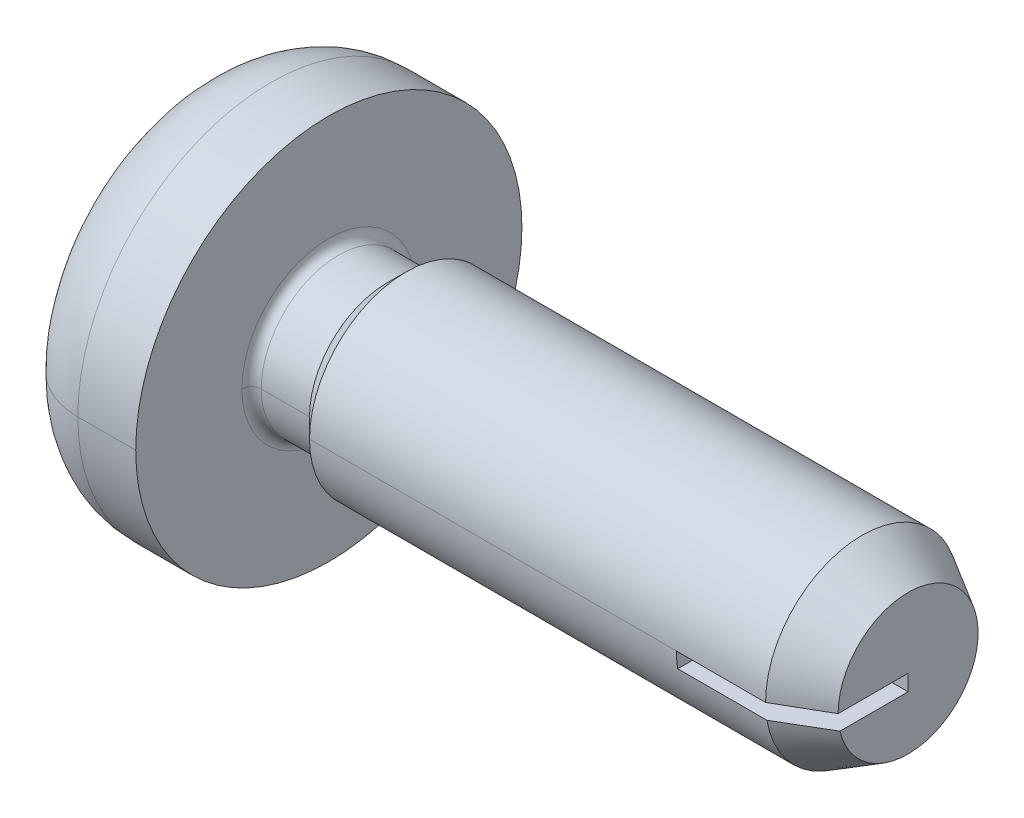
ISO-10303-21;
HEADER;
FILE_DESCRIPTION(('STEP AP214'),'2;1');
FILE_NAME('part.step','',(''),(''),'','','');
FILE_SCHEMA(('AUTOMOTIVE_DESIGN { 1 0 10303 214 1 1 1 1 }'));
ENDSEC;
DATA;
#1=APPLICATION_CONTEXT('core data for automotive mechanical design processes');
#2=APPLICATION_PROTOCOL_DEFINITION('international standard','automotive_design',2000,#1);
#3=PRODUCT_CONTEXT('',#1,'mechanical');
#4=PRODUCT('Part','Part','',(#3));
#5=PRODUCT_RELATED_PRODUCT_CATEGORY('part','',(#4));
#6=PRODUCT_DEFINITION_FORMATION('','',#4);
#7=PRODUCT_DEFINITION_CONTEXT('part definition',#1,'design');
#8=PRODUCT_DEFINITION('design','',#6,#7);
#9=PRODUCT_DEFINITION_SHAPE('','',#8);
#10=(LENGTH_UNIT() NAMED_UNIT(*) SI_UNIT(.MILLI.,.METRE.));
#11=(NAMED_UNIT(*) PLANE_ANGLE_UNIT() SI_UNIT($,.RADIAN.));
#12=(NAMED_UNIT(*) SI_UNIT($,.STERADIAN.) SOLID_ANGLE_UNIT());
#13=UNCERTAINTY_MEASURE_WITH_UNIT(LENGTH_MEASURE(1.E-05),#10,'distance_accuracy_value','');
#14=(GEOMETRIC_REPRESENTATION_CONTEXT(3) GLOBAL_UNCERTAINTY_ASSIGNED_CONTEXT((#13)) GLOBAL_UNIT_ASSIGNED_CONTEXT((#10,
#11,#12)) REPRESENTATION_CONTEXT('',''));
#15=CARTESIAN_POINT('',(0.,0.,0.));
#16=DIRECTION('',(0.,0.,1.));
#17=DIRECTION('',(1.,0.,0.));
#18=AXIS2_PLACEMENT_3D('',#15,#16,#17);
#19=CARTESIAN_POINT('',(7.4,0.,0.));
#20=DIRECTION('',(0.,0.,-1.));
#21=DIRECTION('',(0.,-1.,0.));
#22=AXIS2_PLACEMENT_3D('',#19,#20,#21);
#23=PLANE('',#22);
#24=DIRECTION('',(0.,1.,0.));
#25=VECTOR('',#24,1.);
#26=CARTESIAN_POINT('',(7.4,0.,0.));
#27=LINE('',#26,#25);
#28=CARTESIAN_POINT('',(7.4,-0.166666666666667,0.));
#29=VERTEX_POINT('',#28);
#30=CARTESIAN_POINT('',(7.4,0.,0.));
#31=VERTEX_POINT('',#30);
#32=EDGE_CURVE('E333',#29,#31,#27,.T.);
#33=ORIENTED_EDGE('',*,*,#32,.T.);
#34=DIRECTION('',(-1.,0.,0.));
#35=VECTOR('',#34,1.);
#36=CARTESIAN_POINT('',(7.4,0.,0.));
#37=LINE('',#36,#35);
#38=CARTESIAN_POINT('',(6.,0.,0.));
#39=VERTEX_POINT('',#38);
#40=EDGE_CURVE('E26',#31,#39,#37,.T.);
#41=ORIENTED_EDGE('',*,*,#40,.T.);
#42=DIRECTION('',(0.,-1.,0.));
#43=VECTOR('',#42,1.);
#44=CARTESIAN_POINT('',(6.,0.,0.));
#45=LINE('',#44,#43);
#46=CARTESIAN_POINT('',(6.,-0.166666666666667,0.));
#47=VERTEX_POINT('',#46);
#48=EDGE_CURVE('E584',#39,#47,#45,.T.);
#49=ORIENTED_EDGE('',*,*,#48,.T.);
#50=DIRECTION('',(1.,0.,0.));
#51=VECTOR('',#50,1.);
#52=CARTESIAN_POINT('',(7.4,-0.166666666666667,0.));
#53=LINE('',#52,#51);
#54=EDGE_CURVE('E11',#47,#29,#53,.T.);
#55=ORIENTED_EDGE('',*,*,#54,.T.);
#56=EDGE_LOOP('',(#33,#41,#49,#55));
#57=FACE_BOUND('',#56,.T.);
#58=ADVANCED_FACE('F17',(#57),#23,.F.);
#59=CARTESIAN_POINT('',(7.4,-0.166666666666667,2.));
#60=DIRECTION('',(0.,1.,0.));
#61=DIRECTION('',(1.,0.,0.));
#62=AXIS2_PLACEMENT_3D('',#59,#60,#61);
#63=PLANE('',#62);
#64=DIRECTION('',(1.,0.,0.));
#65=VECTOR('',#64,1.);
#66=CARTESIAN_POINT('',(0.,-0.166666666666668,0.986013297183269));
#67=LINE('',#66,#65);
#68=CARTESIAN_POINT('',(6.,-0.166666666666667,0.986013297183269));
#69=VERTEX_POINT('',#68);
#70=CARTESIAN_POINT('',(6.92368602791855,-0.166666666666667,0.98601329718327));
#71=VERTEX_POINT('',#70);
#72=EDGE_CURVE('E351',#69,#71,#67,.T.);
#73=ORIENTED_EDGE('',*,*,#72,.T.);
#74=CARTESIAN_POINT('',(7.4,-0.166666666666666,0.705582895358314));
#75=CARTESIAN_POINT('',(7.38300130994477,-0.166666959363703,0.715667010676976));
#76=CARTESIAN_POINT('',(7.36599749108841,-0.166669181672599,0.725742474908279));
#77=CARTESIAN_POINT('',(7.33117802574786,-0.166675338828009,0.746353442960607));
#78=CARTESIAN_POINT('',(7.31336194482135,-0.166679349559202,0.756888212869014));
#79=CARTESIAN_POINT('',(7.27691798817995,-0.166686625474542,0.778418137297362));
#80=CARTESIAN_POINT('',(7.25828972493106,-0.166689848895698,0.789412635760343));
#81=CARTESIAN_POINT('',(7.22022133963915,-0.166694363587721,0.811862070899512));
#82=CARTESIAN_POINT('',(7.20078086420416,-0.1666955655014,0.823316408304389));
#83=CARTESIAN_POINT('',(7.16108802848806,-0.16669558234106,0.846685527933959));
#84=CARTESIAN_POINT('',(7.14083534428021,-0.166694296485835,0.858599759927784));
#85=CARTESIAN_POINT('',(7.09951805944336,-0.166689789509248,0.882888576039516));
#86=CARTESIAN_POINT('',(7.07845315902823,-0.166686493553965,0.895262650157091));
#87=CARTESIAN_POINT('',(7.03551142662372,-0.166679258106796,0.920471012457938));
#88=CARTESIAN_POINT('',(7.01363431560257,-0.166675298842382,0.933304825285911));
#89=CARTESIAN_POINT('',(6.96906811202258,-0.166669003188876,0.95943241077416));
#90=CARTESIAN_POINT('',(6.94637875666407,-0.16666673186243,0.972725735198833));
#91=CARTESIAN_POINT('',(6.92368602791855,-0.166666666666664,0.98601329718327));
#92=B_SPLINE_CURVE_WITH_KNOTS('',3,(#74,#75,#76,#77,#78,#79,#80,#81,#82,#83,#84,#85,#86,#87,#88,
#89,#90,#91),.UNSPECIFIED.,.F.,.F.,(4,2,2,2,2,2,2,2,4),(0.,0.059294205622961,0.121387249759102,
0.186279621922835,0.253971605069076,0.32446331069776,0.397754709070723,0.473845655864087,
0.552735916252404),.UNSPECIFIED.);
#93=CARTESIAN_POINT('',(7.4,-0.166666666666667,0.705582895358315));
#94=VERTEX_POINT('',#93);
#95=EDGE_CURVE('E334',#94,#71,#92,.T.);
#96=ORIENTED_EDGE('',*,*,#95,.F.);
#97=DIRECTION('',(0.,0.,-1.));
#98=VECTOR('',#97,1.);
#99=CARTESIAN_POINT('',(7.4,-0.166666666666667,0.));
#100=LINE('',#99,#98);
#101=EDGE_CURVE('E421',#94,#29,#100,.T.);
#102=ORIENTED_EDGE('',*,*,#101,.T.);
#103=ORIENTED_EDGE('',*,*,#54,.F.);
#104=DIRECTION('',(0.,0.,-1.));
#105=VECTOR('',#104,1.);
#106=CARTESIAN_POINT('',(6.,-0.166666666666667,2.));
#107=LINE('',#106,#105);
#108=EDGE_CURVE('E580',#69,#47,#107,.T.);
#109=ORIENTED_EDGE('',*,*,#108,.F.);
#110=EDGE_LOOP('',(#73,#96,#102,#103,#109));
#111=FACE_BOUND('',#110,.T.);
#112=ADVANCED_FACE('F713',(#111),#63,.T.);
#113=CARTESIAN_POINT('',(7.4,0.,2.));
#114=DIRECTION('',(0.,-1.,0.));
#115=DIRECTION('',(-1.,0.,0.));
#116=AXIS2_PLACEMENT_3D('',#113,#114,#115);
#117=PLANE('',#116);
#118=DIRECTION('',(-1.,0.,0.));
#119=VECTOR('',#118,1.);
#120=CARTESIAN_POINT('',(0.,0.,1.));
#121=LINE('',#120,#119);
#122=CARTESIAN_POINT('',(6.92368602791855,0.,1.));
#123=VERTEX_POINT('',#122);
#124=CARTESIAN_POINT('',(6.,0.,1.));
#125=VERTEX_POINT('',#124);
#126=EDGE_CURVE('E398',#123,#125,#121,.T.);
#127=ORIENTED_EDGE('',*,*,#126,.T.);
#128=DIRECTION('',(0.,0.,-1.));
#129=VECTOR('',#128,1.);
#130=CARTESIAN_POINT('',(6.,0.,2.));
#131=LINE('',#130,#129);
#132=EDGE_CURVE('E587',#125,#39,#131,.T.);
#133=ORIENTED_EDGE('',*,*,#132,.T.);
#134=ORIENTED_EDGE('',*,*,#40,.F.);
#135=DIRECTION('',(0.,0.,1.));
#136=VECTOR('',#135,1.);
#137=CARTESIAN_POINT('',(7.4,0.,0.));
#138=LINE('',#137,#136);
#139=CARTESIAN_POINT('',(7.4,0.,0.725));
#140=VERTEX_POINT('',#139);
#141=EDGE_CURVE('E331',#31,#140,#138,.T.);
#142=ORIENTED_EDGE('',*,*,#141,.T.);
#143=DIRECTION('',(0.866025403784442,0.,-0.499999999999994));
#144=VECTOR('',#143,1.);
#145=CARTESIAN_POINT('',(8.65573683548746,0.,0.));
#146=LINE('',#145,#144);
#147=EDGE_CURVE('E411',#123,#140,#146,.T.);
#148=ORIENTED_EDGE('',*,*,#147,.F.);
#149=EDGE_LOOP('',(#127,#133,#134,#142,#148));
#150=FACE_BOUND('',#149,.T.);
#151=ADVANCED_FACE('F710',(#150),#117,.T.);
#152=CARTESIAN_POINT('',(6.,0.,2.));
#153=DIRECTION('',(1.,0.,0.));
#154=DIRECTION('',(0.,1.,0.));
#155=AXIS2_PLACEMENT_3D('',#152,#153,#154);
#156=PLANE('',#155);
#157=CARTESIAN_POINT('',(6.,0.,0.));
#158=DIRECTION('',(1.,0.,0.));
#159=DIRECTION('',(0.,0.,-1.));
#160=AXIS2_PLACEMENT_3D('',#157,#158,#159);
#161=CIRCLE('',#160,1.);
#162=EDGE_CURVE('E346',#125,#69,#161,.T.);
#163=ORIENTED_EDGE('',*,*,#162,.T.);
#164=ORIENTED_EDGE('',*,*,#108,.T.);
#165=ORIENTED_EDGE('',*,*,#48,.F.);
#166=ORIENTED_EDGE('',*,*,#132,.F.);
#167=EDGE_LOOP('',(#163,#164,#165,#166));
#168=FACE_BOUND('',#167,.T.);
#169=ADVANCED_FACE('F706',(#168),#156,.T.);
#170=CARTESIAN_POINT('',(1.25264170234784,-0.479,0.265));
#171=DIRECTION('',(0.,-0.707106781186546,0.707106781186549));
#172=DIRECTION('',(-1.,0.,0.));
#173=AXIS2_PLACEMENT_3D('',#170,#171,#172);
#174=PLANE('',#173);
#175=DIRECTION('',(0.,-0.707106781186549,-0.707106781186546));
#176=VECTOR('',#175,1.);
#177=CARTESIAN_POINT('',(0.95,-0.479,0.265));
#178=LINE('',#177,#176);
#179=CARTESIAN_POINT('',(0.95,-0.265,0.479));
#180=VERTEX_POINT('',#179);
#181=CARTESIAN_POINT('',(0.95,-0.479,0.265));
#182=VERTEX_POINT('',#181);
#183=EDGE_CURVE('E341',#180,#182,#178,.T.);
#184=ORIENTED_EDGE('',*,*,#183,.T.);
#185=DIRECTION('',(-1.,0.,0.));
#186=VECTOR('',#185,1.);
#187=CARTESIAN_POINT('',(1.25264170234784,-0.479,0.265));
#188=LINE('',#187,#186);
#189=CARTESIAN_POINT('',(0.,-0.479,0.265));
#190=VERTEX_POINT('',#189);
#191=EDGE_CURVE('E495',#182,#190,#188,.T.);
#192=ORIENTED_EDGE('',*,*,#191,.T.);
#193=DIRECTION('',(0.,0.707106781186549,0.707106781186546));
#194=VECTOR('',#193,1.);
#195=CARTESIAN_POINT('',(0.,-0.479,0.265));
#196=LINE('',#195,#194);
#197=CARTESIAN_POINT('',(0.,-0.265,0.479));
#198=VERTEX_POINT('',#197);
#199=EDGE_CURVE('E440',#190,#198,#196,.T.);
#200=ORIENTED_EDGE('',*,*,#199,.T.);
#201=DIRECTION('',(-1.,0.,0.));
#202=VECTOR('',#201,1.);
#203=CARTESIAN_POINT('',(1.25264170234784,-0.265,0.479));
#204=LINE('',#203,#202);
#205=EDGE_CURVE('E316',#180,#198,#204,.T.);
#206=ORIENTED_EDGE('',*,*,#205,.F.);
#207=EDGE_LOOP('',(#184,#192,#200,#206));
#208=FACE_BOUND('',#207,.T.);
#209=ADVANCED_FACE('F702',(#208),#174,.F.);
#210=CARTESIAN_POINT('',(1.25264170234784,-0.479,-0.265));
#211=DIRECTION('',(0.,-0.707106781186546,-0.707106781186549));
#212=DIRECTION('',(0.,-0.707106781186549,0.707106781186546));
#213=AXIS2_PLACEMENT_3D('',#210,#211,#212);
#214=PLANE('',#213);
#215=DIRECTION('',(0.,0.707106781186549,-0.707106781186546));
#216=VECTOR('',#215,1.);
#217=CARTESIAN_POINT('',(0.95,-0.479,-0.265));
#218=LINE('',#217,#216);
#219=CARTESIAN_POINT('',(0.95,-0.479,-0.265));
#220=VERTEX_POINT('',#219);
#221=CARTESIAN_POINT('',(0.95,-0.265,-0.479));
#222=VERTEX_POINT('',#221);
#223=EDGE_CURVE('E577',#220,#222,#218,.T.);
#224=ORIENTED_EDGE('',*,*,#223,.T.);
#225=DIRECTION('',(-1.,0.,0.));
#226=VECTOR('',#225,1.);
#227=CARTESIAN_POINT('',(1.25264170234784,-0.265,-0.479));
#228=LINE('',#227,#226);
#229=CARTESIAN_POINT('',(0.,-0.265,-0.479));
#230=VERTEX_POINT('',#229);
#231=EDGE_CURVE('E407',#222,#230,#228,.T.);
#232=ORIENTED_EDGE('',*,*,#231,.T.);
#233=DIRECTION('',(0.,-0.707106781186549,0.707106781186546));
#234=VECTOR('',#233,1.);
#235=CARTESIAN_POINT('',(0.,-0.479,-0.265));
#236=LINE('',#235,#234);
#237=CARTESIAN_POINT('',(0.,-0.479,-0.265));
#238=VERTEX_POINT('',#237);
#239=EDGE_CURVE('E449',#230,#238,#236,.T.);
#240=ORIENTED_EDGE('',*,*,#239,.T.);
#241=DIRECTION('',(-1.,0.,0.));
#242=VECTOR('',#241,1.);
#243=CARTESIAN_POINT('',(1.25264170234784,-0.479,-0.265));
#244=LINE('',#243,#242);
#245=EDGE_CURVE('E408',#220,#238,#244,.T.);
#246=ORIENTED_EDGE('',*,*,#245,.F.);
#247=EDGE_LOOP('',(#224,#232,#240,#246));
#248=FACE_BOUND('',#247,.T.);
#249=ADVANCED_FACE('F669',(#248),#214,.F.);
#250=CARTESIAN_POINT('',(1.25264170234784,0.479,-0.265));
#251=DIRECTION('',(0.,0.707106781186547,-0.707106781186549));
#252=DIRECTION('',(-1.,0.,0.));
#253=AXIS2_PLACEMENT_3D('',#250,#251,#252);
#254=PLANE('',#253);
#255=DIRECTION('',(0.,0.707106781186549,0.707106781186547));
#256=VECTOR('',#255,1.);
#257=CARTESIAN_POINT('',(0.95,0.479,-0.265));
#258=LINE('',#257,#256);
#259=CARTESIAN_POINT('',(0.95,0.265,-0.479));
#260=VERTEX_POINT('',#259);
#261=CARTESIAN_POINT('',(0.95,0.479,-0.265));
#262=VERTEX_POINT('',#261);
#263=EDGE_CURVE('E418',#260,#262,#258,.T.);
#264=ORIENTED_EDGE('',*,*,#263,.T.);
#265=DIRECTION('',(-1.,0.,0.));
#266=VECTOR('',#265,1.);
#267=CARTESIAN_POINT('',(1.25264170234784,0.479,-0.265));
#268=LINE('',#267,#266);
#269=CARTESIAN_POINT('',(0.,0.479,-0.265));
#270=VERTEX_POINT('',#269);
#271=EDGE_CURVE('E283',#262,#270,#268,.T.);
#272=ORIENTED_EDGE('',*,*,#271,.T.);
#273=DIRECTION('',(0.,-0.707106781186549,-0.707106781186547));
#274=VECTOR('',#273,1.);
#275=CARTESIAN_POINT('',(0.,0.479,-0.265));
#276=LINE('',#275,#274);
#277=CARTESIAN_POINT('',(0.,0.265,-0.479));
#278=VERTEX_POINT('',#277);
#279=EDGE_CURVE('E477',#270,#278,#276,.T.);
#280=ORIENTED_EDGE('',*,*,#279,.T.);
#281=DIRECTION('',(-1.,0.,0.));
#282=VECTOR('',#281,1.);
#283=CARTESIAN_POINT('',(1.25264170234784,0.265,-0.479));
#284=LINE('',#283,#282);
#285=EDGE_CURVE('E425',#260,#278,#284,.T.);
#286=ORIENTED_EDGE('',*,*,#285,.F.);
#287=EDGE_LOOP('',(#264,#272,#280,#286));
#288=FACE_BOUND('',#287,.T.);
#289=ADVANCED_FACE('F665',(#288),#254,.F.);
#290=CARTESIAN_POINT('',(1.25264170234784,0.479,0.265));
#291=DIRECTION('',(0.,0.707106781186547,0.707106781186549));
#292=DIRECTION('',(1.,0.,0.));
#293=AXIS2_PLACEMENT_3D('',#290,#291,#292);
#294=PLANE('',#293);
#295=DIRECTION('',(0.,-0.707106781186549,0.707106781186547));
#296=VECTOR('',#295,1.);
#297=CARTESIAN_POINT('',(0.95,0.479,0.265));
#298=LINE('',#297,#296);
#299=CARTESIAN_POINT('',(0.95,0.479,0.265));
#300=VERTEX_POINT('',#299);
#301=CARTESIAN_POINT('',(0.95,0.265,0.479));
#302=VERTEX_POINT('',#301);
#303=EDGE_CURVE('E344',#300,#302,#298,.T.);
#304=ORIENTED_EDGE('',*,*,#303,.T.);
#305=DIRECTION('',(-1.,0.,0.));
#306=VECTOR('',#305,1.);
#307=CARTESIAN_POINT('',(1.25264170234784,0.265,0.479));
#308=LINE('',#307,#306);
#309=CARTESIAN_POINT('',(0.,0.265,0.479));
#310=VERTEX_POINT('',#309);
#311=EDGE_CURVE('E436',#302,#310,#308,.T.);
#312=ORIENTED_EDGE('',*,*,#311,.T.);
#313=DIRECTION('',(0.,0.707106781186549,-0.707106781186547));
#314=VECTOR('',#313,1.);
#315=CARTESIAN_POINT('',(0.,0.479,0.265));
#316=LINE('',#315,#314);
#317=CARTESIAN_POINT('',(0.,0.479,0.265));
#318=VERTEX_POINT('',#317);
#319=EDGE_CURVE('E503',#310,#318,#316,.T.);
#320=ORIENTED_EDGE('',*,*,#319,.T.);
#321=DIRECTION('',(-1.,0.,0.));
#322=VECTOR('',#321,1.);
#323=CARTESIAN_POINT('',(1.25264170234784,0.479,0.265));
#324=LINE('',#323,#322);
#325=EDGE_CURVE('E371',#300,#318,#324,.T.);
#326=ORIENTED_EDGE('',*,*,#325,.F.);
#327=EDGE_LOOP('',(#304,#312,#320,#326));
#328=FACE_BOUND('',#327,.T.);
#329=ADVANCED_FACE('F668',(#328),#294,.F.);
#330=CARTESIAN_POINT('',(0.95,0.265,-0.265));
#331=DIRECTION('',(-1.,0.,0.));
#332=DIRECTION('',(0.,0.,1.));
#333=AXIS2_PLACEMENT_3D('',#330,#331,#332);
#334=PLANE('',#333);
#335=DIRECTION('',(0.,-1.,0.));
#336=VECTOR('',#335,1.);
#337=CARTESIAN_POINT('',(0.95,-0.265,0.265));
#338=LINE('',#337,#336);
#339=CARTESIAN_POINT('',(0.95,-0.724228277447107,0.265));
#340=VERTEX_POINT('',#339);
#341=EDGE_CURVE('E490',#182,#340,#338,.T.);
#342=ORIENTED_EDGE('',*,*,#341,.F.);
#343=ORIENTED_EDGE('',*,*,#183,.F.);
#344=DIRECTION('',(0.,0.,-1.));
#345=VECTOR('',#344,1.);
#346=CARTESIAN_POINT('',(0.95,-0.265,0.265));
#347=LINE('',#346,#345);
#348=CARTESIAN_POINT('',(0.95,-0.265,0.724228277447107));
#349=VERTEX_POINT('',#348);
#350=EDGE_CURVE('E318',#349,#180,#347,.T.);
#351=ORIENTED_EDGE('',*,*,#350,.F.);
#352=DIRECTION('',(0.,-1.,0.));
#353=VECTOR('',#352,1.);
#354=CARTESIAN_POINT('',(0.95,0.265,0.724228277447107));
#355=LINE('',#354,#353);
#356=CARTESIAN_POINT('',(0.95,0.265,0.724228277447107));
#357=VERTEX_POINT('',#356);
#358=EDGE_CURVE('E432',#357,#349,#355,.T.);
#359=ORIENTED_EDGE('',*,*,#358,.F.);
#360=DIRECTION('',(0.,0.,1.));
#361=VECTOR('',#360,1.);
#362=CARTESIAN_POINT('',(0.95,0.265,0.265));
#363=LINE('',#362,#361);
#364=EDGE_CURVE('E481',#302,#357,#363,.T.);
#365=ORIENTED_EDGE('',*,*,#364,.F.);
#366=ORIENTED_EDGE('',*,*,#303,.F.);
#367=DIRECTION('',(0.,-1.,0.));
#368=VECTOR('',#367,1.);
#369=CARTESIAN_POINT('',(0.95,1.07,0.265));
#370=LINE('',#369,#368);
#371=CARTESIAN_POINT('',(0.95,0.724228277447107,0.265));
#372=VERTEX_POINT('',#371);
#373=EDGE_CURVE('E374',#372,#300,#370,.T.);
#374=ORIENTED_EDGE('',*,*,#373,.F.);
#375=DIRECTION('',(0.,0.,1.));
#376=VECTOR('',#375,1.);
#377=CARTESIAN_POINT('',(0.95,0.724228277447107,-0.265));
#378=LINE('',#377,#376);
#379=CARTESIAN_POINT('',(0.95,0.724228277447107,-0.265));
#380=VERTEX_POINT('',#379);
#381=EDGE_CURVE('E520',#380,#372,#378,.T.);
#382=ORIENTED_EDGE('',*,*,#381,.F.);
#383=DIRECTION('',(0.,1.,0.));
#384=VECTOR('',#383,1.);
#385=CARTESIAN_POINT('',(0.95,1.07,-0.265));
#386=LINE('',#385,#384);
#387=EDGE_CURVE('E523',#262,#380,#386,.T.);
#388=ORIENTED_EDGE('',*,*,#387,.F.);
#389=ORIENTED_EDGE('',*,*,#263,.F.);
#390=DIRECTION('',(0.,0.,1.));
#391=VECTOR('',#390,1.);
#392=CARTESIAN_POINT('',(0.95,0.265,-1.07));
#393=LINE('',#392,#391);
#394=CARTESIAN_POINT('',(0.95,0.265,-0.724228277447106));
#395=VERTEX_POINT('',#394);
#396=EDGE_CURVE('E345',#395,#260,#393,.T.);
#397=ORIENTED_EDGE('',*,*,#396,.F.);
#398=DIRECTION('',(0.,1.,0.));
#399=VECTOR('',#398,1.);
#400=CARTESIAN_POINT('',(0.95,0.265,-0.724228277447106));
#401=LINE('',#400,#399);
#402=CARTESIAN_POINT('',(0.95,-0.265,-0.724228277447107));
#403=VERTEX_POINT('',#402);
#404=EDGE_CURVE('E560',#403,#395,#401,.T.);
#405=ORIENTED_EDGE('',*,*,#404,.F.);
#406=DIRECTION('',(0.,0.,-1.));
#407=VECTOR('',#406,1.);
#408=CARTESIAN_POINT('',(0.95,-0.265,-1.07));
#409=LINE('',#408,#407);
#410=EDGE_CURVE('E561',#222,#403,#409,.T.);
#411=ORIENTED_EDGE('',*,*,#410,.F.);
#412=ORIENTED_EDGE('',*,*,#223,.F.);
#413=DIRECTION('',(0.,1.,0.));
#414=VECTOR('',#413,1.);
#415=CARTESIAN_POINT('',(0.95,-0.265,-0.265));
#416=LINE('',#415,#414);
#417=CARTESIAN_POINT('',(0.95,-0.724228277447107,-0.265));
#418=VERTEX_POINT('',#417);
#419=EDGE_CURVE('E403',#418,#220,#416,.T.);
#420=ORIENTED_EDGE('',*,*,#419,.F.);
#421=DIRECTION('',(0.,0.,-1.));
#422=VECTOR('',#421,1.);
#423=CARTESIAN_POINT('',(0.95,-0.724228277447107,-0.265));
#424=LINE('',#423,#422);
#425=EDGE_CURVE('E548',#340,#418,#424,.T.);
#426=ORIENTED_EDGE('',*,*,#425,.F.);
#427=EDGE_LOOP('',(#342,#343,#351,#359,#365,#366,#374,#382,#388,#389,#397,#405,#411,#412,#420,#426));
#428=FACE_BOUND('',#427,.T.);
#429=ADVANCED_FACE('F692',(#428),#334,.T.);
#430=CARTESIAN_POINT('',(0.95,0.265,-1.07));
#431=DIRECTION('',(0.,-1.,0.));
#432=DIRECTION('',(0.,0.,-1.));
#433=AXIS2_PLACEMENT_3D('',#430,#431,#432);
#434=PLANE('',#433);
#435=ORIENTED_EDGE('',*,*,#285,.T.);
#436=DIRECTION('',(0.,0.,1.));
#437=VECTOR('',#436,1.);
#438=CARTESIAN_POINT('',(0.,0.265,-1.07));
#439=LINE('',#438,#437);
#440=CARTESIAN_POINT('',(0.,0.265,-1.07));
#441=VERTEX_POINT('',#440);
#442=EDGE_CURVE('E468',#441,#278,#439,.T.);
#443=ORIENTED_EDGE('',*,*,#442,.F.);
#444=DIRECTION('',(-0.939692620785908,0.,-0.342020143325669));
#445=VECTOR('',#444,1.);
#446=CARTESIAN_POINT('',(0.838871110481514,0.265,-0.764675885398893));
#447=LINE('',#446,#445);
#448=EDGE_CURVE('E570',#395,#441,#447,.T.);
#449=ORIENTED_EDGE('',*,*,#448,.F.);
#450=ORIENTED_EDGE('',*,*,#396,.T.);
#451=EDGE_LOOP('',(#435,#443,#449,#450));
#452=FACE_BOUND('',#451,.T.);
#453=ADVANCED_FACE('F688',(#452),#434,.T.);
#454=CARTESIAN_POINT('',(0.,0.265,-1.07));
#455=DIRECTION('',(-0.342020143325669,0.,0.939692620785908));
#456=DIRECTION('',(0.,1.,0.));
#457=AXIS2_PLACEMENT_3D('',#454,#455,#456);
#458=PLANE('',#457);
#459=DIRECTION('',(0.,1.,0.));
#460=VECTOR('',#459,1.);
#461=CARTESIAN_POINT('',(0.,0.265,-1.07));
#462=LINE('',#461,#460);
#463=CARTESIAN_POINT('',(0.,-0.265,-1.07));
#464=VERTEX_POINT('',#463);
#465=EDGE_CURVE('E464',#464,#441,#462,.T.);
#466=ORIENTED_EDGE('',*,*,#465,.F.);
#467=DIRECTION('',(-0.939692620785908,0.,-0.342020143325669));
#468=VECTOR('',#467,1.);
#469=CARTESIAN_POINT('',(0.,-0.265,-1.07));
#470=LINE('',#469,#468);
#471=EDGE_CURVE('E557',#403,#464,#470,.T.);
#472=ORIENTED_EDGE('',*,*,#471,.F.);
#473=ORIENTED_EDGE('',*,*,#404,.T.);
#474=ORIENTED_EDGE('',*,*,#448,.T.);
#475=EDGE_LOOP('',(#466,#472,#473,#474));
#476=FACE_BOUND('',#475,.T.);
#477=ADVANCED_FACE('F684',(#476),#458,.T.);
#478=CARTESIAN_POINT('',(0.95,-0.265,-1.07));
#479=DIRECTION('',(0.,1.,0.));
#480=DIRECTION('',(0.,0.,-1.));
#481=AXIS2_PLACEMENT_3D('',#478,#479,#480);
#482=PLANE('',#481);
#483=ORIENTED_EDGE('',*,*,#231,.F.);
#484=ORIENTED_EDGE('',*,*,#410,.T.);
#485=ORIENTED_EDGE('',*,*,#471,.T.);
#486=DIRECTION('',(0.,0.,-1.));
#487=VECTOR('',#486,1.);
#488=CARTESIAN_POINT('',(0.,-0.265,-1.07));
#489=LINE('',#488,#487);
#490=EDGE_CURVE('E453',#230,#464,#489,.T.);
#491=ORIENTED_EDGE('',*,*,#490,.F.);
#492=EDGE_LOOP('',(#483,#484,#485,#491));
#493=FACE_BOUND('',#492,.T.);
#494=ADVANCED_FACE('F680',(#493),#482,.T.);
#495=CARTESIAN_POINT('',(0.95,-0.265,-0.265));
#496=DIRECTION('',(0.,0.,1.));
#497=DIRECTION('',(1.,0.,0.));
#498=AXIS2_PLACEMENT_3D('',#495,#496,#497);
#499=PLANE('',#498);
#500=ORIENTED_EDGE('',*,*,#245,.T.);
#501=DIRECTION('',(0.,1.,0.));
#502=VECTOR('',#501,1.);
#503=CARTESIAN_POINT('',(0.,-0.265,-0.265));
#504=LINE('',#503,#502);
#505=CARTESIAN_POINT('',(0.,-1.07,-0.265));
#506=VERTEX_POINT('',#505);
#507=EDGE_CURVE('E454',#506,#238,#504,.T.);
#508=ORIENTED_EDGE('',*,*,#507,.F.);
#509=DIRECTION('',(-0.939692620785908,-0.342020143325669,0.));
#510=VECTOR('',#509,1.);
#511=CARTESIAN_POINT('',(1.09759312338035,-0.670508773754281,-0.265));
#512=LINE('',#511,#510);
#513=EDGE_CURVE('E552',#418,#506,#512,.T.);
#514=ORIENTED_EDGE('',*,*,#513,.F.);
#515=ORIENTED_EDGE('',*,*,#419,.T.);
#516=EDGE_LOOP('',(#500,#508,#514,#515));
#517=FACE_BOUND('',#516,.T.);
#518=ADVANCED_FACE('F676',(#517),#499,.T.);
#519=CARTESIAN_POINT('',(0.,-1.07,-0.265));
#520=DIRECTION('',(-0.342020143325669,0.939692620785908,0.));
#521=DIRECTION('',(0.,0.,1.));
#522=AXIS2_PLACEMENT_3D('',#519,#520,#521);
#523=PLANE('',#522);
#524=DIRECTION('',(0.,0.,-1.));
#525=VECTOR('',#524,1.);
#526=CARTESIAN_POINT('',(0.,-1.07,-0.265));
#527=LINE('',#526,#525);
#528=CARTESIAN_POINT('',(0.,-1.07,0.265));
#529=VERTEX_POINT('',#528);
#530=EDGE_CURVE('E448',#529,#506,#527,.T.);
#531=ORIENTED_EDGE('',*,*,#530,.F.);
#532=DIRECTION('',(-0.939692620785908,-0.342020143325669,0.));
#533=VECTOR('',#532,1.);
#534=CARTESIAN_POINT('',(0.,-1.07,0.265));
#535=LINE('',#534,#533);
#536=EDGE_CURVE('E494',#340,#529,#535,.T.);
#537=ORIENTED_EDGE('',*,*,#536,.F.);
#538=ORIENTED_EDGE('',*,*,#425,.T.);
#539=ORIENTED_EDGE('',*,*,#513,.T.);
#540=EDGE_LOOP('',(#531,#537,#538,#539));
#541=FACE_BOUND('',#540,.T.);
#542=ADVANCED_FACE('F652',(#541),#523,.T.);
#543=CARTESIAN_POINT('',(0.95,-0.265,0.265));
#544=DIRECTION('',(0.,0.,-1.));
#545=DIRECTION('',(0.,-1.,0.));
#546=AXIS2_PLACEMENT_3D('',#543,#544,#545);
#547=PLANE('',#546);
#548=ORIENTED_EDGE('',*,*,#191,.F.);
#549=ORIENTED_EDGE('',*,*,#341,.T.);
#550=ORIENTED_EDGE('',*,*,#536,.T.);
#551=DIRECTION('',(0.,-1.,0.));
#552=VECTOR('',#551,1.);
#553=CARTESIAN_POINT('',(0.,-0.265,0.265));
#554=LINE('',#553,#552);
#555=EDGE_CURVE('E444',#190,#529,#554,.T.);
#556=ORIENTED_EDGE('',*,*,#555,.F.);
#557=EDGE_LOOP('',(#548,#549,#550,#556));
#558=FACE_BOUND('',#557,.T.);
#559=ADVANCED_FACE('F648',(#558),#547,.T.);
#560=CARTESIAN_POINT('',(0.95,-0.265,0.265));
#561=DIRECTION('',(0.,1.,0.));
#562=DIRECTION('',(0.,0.,-1.));
#563=AXIS2_PLACEMENT_3D('',#560,#561,#562);
#564=PLANE('',#563);
#565=ORIENTED_EDGE('',*,*,#205,.T.);
#566=DIRECTION('',(0.,0.,-1.));
#567=VECTOR('',#566,1.);
#568=CARTESIAN_POINT('',(0.,-0.265,0.265));
#569=LINE('',#568,#567);
#570=CARTESIAN_POINT('',(0.,-0.265,1.07));
#571=VERTEX_POINT('',#570);
#572=EDGE_CURVE('E429',#571,#198,#569,.T.);
#573=ORIENTED_EDGE('',*,*,#572,.F.);
#574=DIRECTION('',(-0.939692620785908,0.,0.342020143325669));
#575=VECTOR('',#574,1.);
#576=CARTESIAN_POINT('',(1.09759312338035,-0.265,0.670508773754281));
#577=LINE('',#576,#575);
#578=EDGE_CURVE('E319',#349,#571,#577,.T.);
#579=ORIENTED_EDGE('',*,*,#578,.F.);
#580=ORIENTED_EDGE('',*,*,#350,.T.);
#581=EDGE_LOOP('',(#565,#573,#579,#580));
#582=FACE_BOUND('',#581,.T.);
#583=ADVANCED_FACE('F651',(#582),#564,.T.);
#584=CARTESIAN_POINT('',(0.,0.265,1.07));
#585=DIRECTION('',(-0.342020143325669,0.,-0.939692620785908));
#586=DIRECTION('',(-0.939692620785908,0.,0.342020143325669));
#587=AXIS2_PLACEMENT_3D('',#584,#585,#586);
#588=PLANE('',#587);
#589=DIRECTION('',(0.,-1.,0.));
#590=VECTOR('',#589,1.);
#591=CARTESIAN_POINT('',(0.,0.265,1.07));
#592=LINE('',#591,#590);
#593=CARTESIAN_POINT('',(0.,0.265,1.07));
#594=VERTEX_POINT('',#593);
#595=EDGE_CURVE('E473',#594,#571,#592,.T.);
#596=ORIENTED_EDGE('',*,*,#595,.F.);
#597=DIRECTION('',(-0.939692620785908,0.,0.342020143325669));
#598=VECTOR('',#597,1.);
#599=CARTESIAN_POINT('',(0.,0.265,1.07));
#600=LINE('',#599,#598);
#601=EDGE_CURVE('E478',#357,#594,#600,.T.);
#602=ORIENTED_EDGE('',*,*,#601,.F.);
#603=ORIENTED_EDGE('',*,*,#358,.T.);
#604=ORIENTED_EDGE('',*,*,#578,.T.);
#605=EDGE_LOOP('',(#596,#602,#603,#604));
#606=FACE_BOUND('',#605,.T.);
#607=ADVANCED_FACE('F660',(#606),#588,.T.);
#608=CARTESIAN_POINT('',(0.95,0.265,0.265));
#609=DIRECTION('',(0.,-1.,0.));
#610=DIRECTION('',(0.,0.,-1.));
#611=AXIS2_PLACEMENT_3D('',#608,#609,#610);
#612=PLANE('',#611);
#613=ORIENTED_EDGE('',*,*,#311,.F.);
#614=ORIENTED_EDGE('',*,*,#364,.T.);
#615=ORIENTED_EDGE('',*,*,#601,.T.);
#616=DIRECTION('',(0.,0.,1.));
#617=VECTOR('',#616,1.);
#618=CARTESIAN_POINT('',(0.,0.265,0.265));
#619=LINE('',#618,#617);
#620=EDGE_CURVE('E507',#310,#594,#619,.T.);
#621=ORIENTED_EDGE('',*,*,#620,.F.);
#622=EDGE_LOOP('',(#613,#614,#615,#621));
#623=FACE_BOUND('',#622,.T.);
#624=ADVANCED_FACE('F656',(#623),#612,.T.);
#625=CARTESIAN_POINT('',(0.95,1.07,0.265));
#626=DIRECTION('',(0.,0.,-1.));
#627=DIRECTION('',(-1.,0.,0.));
#628=AXIS2_PLACEMENT_3D('',#625,#626,#627);
#629=PLANE('',#628);
#630=ORIENTED_EDGE('',*,*,#325,.T.);
#631=DIRECTION('',(0.,-1.,0.));
#632=VECTOR('',#631,1.);
#633=CARTESIAN_POINT('',(0.,1.07,0.265));
#634=LINE('',#633,#632);
#635=CARTESIAN_POINT('',(0.,1.07,0.265));
#636=VERTEX_POINT('',#635);
#637=EDGE_CURVE('E499',#636,#318,#634,.T.);
#638=ORIENTED_EDGE('',*,*,#637,.F.);
#639=DIRECTION('',(-0.939692620785908,0.342020143325669,0.));
#640=VECTOR('',#639,1.);
#641=CARTESIAN_POINT('',(0.838871110481514,0.764675885398893,0.265));
#642=LINE('',#641,#640);
#643=EDGE_CURVE('E375',#372,#636,#642,.T.);
#644=ORIENTED_EDGE('',*,*,#643,.F.);
#645=ORIENTED_EDGE('',*,*,#373,.T.);
#646=EDGE_LOOP('',(#630,#638,#644,#645));
#647=FACE_BOUND('',#646,.T.);
#648=ADVANCED_FACE('F646',(#647),#629,.T.);
#649=CARTESIAN_POINT('',(0.,1.07,-0.265));
#650=DIRECTION('',(-0.342020143325669,-0.939692620785908,0.));
#651=DIRECTION('',(-0.939692620785908,0.342020143325669,0.));
#652=AXIS2_PLACEMENT_3D('',#649,#650,#651);
#653=PLANE('',#652);
#654=DIRECTION('',(0.,0.,1.));
#655=VECTOR('',#654,1.);
#656=CARTESIAN_POINT('',(0.,1.07,-0.265));
#657=LINE('',#656,#655);
#658=CARTESIAN_POINT('',(0.,1.07,-0.265));
#659=VERTEX_POINT('',#658);
#660=EDGE_CURVE('E489',#659,#636,#657,.T.);
#661=ORIENTED_EDGE('',*,*,#660,.F.);
#662=DIRECTION('',(-0.939692620785908,0.342020143325669,0.));
#663=VECTOR('',#662,1.);
#664=CARTESIAN_POINT('',(0.,1.07,-0.265));
#665=LINE('',#664,#663);
#666=EDGE_CURVE('E527',#380,#659,#665,.T.);
#667=ORIENTED_EDGE('',*,*,#666,.F.);
#668=ORIENTED_EDGE('',*,*,#381,.T.);
#669=ORIENTED_EDGE('',*,*,#643,.T.);
#670=EDGE_LOOP('',(#661,#667,#668,#669));
#671=FACE_BOUND('',#670,.T.);
#672=ADVANCED_FACE('F642',(#671),#653,.T.);
#673=CARTESIAN_POINT('',(0.95,1.07,-0.265));
#674=DIRECTION('',(0.,0.,1.));
#675=DIRECTION('',(1.,0.,0.));
#676=AXIS2_PLACEMENT_3D('',#673,#674,#675);
#677=PLANE('',#676);
#678=ORIENTED_EDGE('',*,*,#271,.F.);
#679=ORIENTED_EDGE('',*,*,#387,.T.);
#680=ORIENTED_EDGE('',*,*,#666,.T.);
#681=DIRECTION('',(0.,1.,0.));
#682=VECTOR('',#681,1.);
#683=CARTESIAN_POINT('',(0.,1.07,-0.265));
#684=LINE('',#683,#682);
#685=EDGE_CURVE('E485',#270,#659,#684,.T.);
#686=ORIENTED_EDGE('',*,*,#685,.F.);
#687=EDGE_LOOP('',(#678,#679,#680,#686));
#688=FACE_BOUND('',#687,.T.);
#689=ADVANCED_FACE('F639',(#688),#677,.T.);
#690=CARTESIAN_POINT('',(0.8,0.,0.));
#691=DIRECTION('',(-1.,0.,0.));
#692=DIRECTION('',(0.,0.,1.));
#693=AXIS2_PLACEMENT_3D('',#690,#691,#692);
#694=TOROIDAL_SURFACE('',#693,1.2,0.8);
#695=CARTESIAN_POINT('',(0.8,0.,-1.2));
#696=DIRECTION('',(0.,1.,0.));
#697=DIRECTION('',(0.,0.,1.));
#698=AXIS2_PLACEMENT_3D('',#695,#696,#697);
#699=CIRCLE('',#698,0.8);
#700=CARTESIAN_POINT('',(0.8,0.,-2.));
#701=VERTEX_POINT('',#700);
#702=CARTESIAN_POINT('',(0.,0.,-1.2));
#703=VERTEX_POINT('',#702);
#704=EDGE_CURVE('E277',#701,#703,#699,.T.);
#705=ORIENTED_EDGE('',*,*,#704,.F.);
#706=CARTESIAN_POINT('',(0.8,0.,0.));
#707=DIRECTION('',(-1.,0.,0.));
#708=DIRECTION('',(0.,0.,1.));
#709=AXIS2_PLACEMENT_3D('',#706,#707,#708);
#710=CIRCLE('',#709,2.);
#711=CARTESIAN_POINT('',(0.8,0.,2.));
#712=VERTEX_POINT('',#711);
#713=EDGE_CURVE('E270',#701,#712,#710,.T.);
#714=ORIENTED_EDGE('',*,*,#713,.T.);
#715=CARTESIAN_POINT('',(0.8,0.,1.2));
#716=DIRECTION('',(0.,-1.,0.));
#717=DIRECTION('',(0.,0.,-1.));
#718=AXIS2_PLACEMENT_3D('',#715,#716,#717);
#719=CIRCLE('',#718,0.8);
#720=CARTESIAN_POINT('',(0.,0.,1.2));
#721=VERTEX_POINT('',#720);
#722=EDGE_CURVE('E274',#712,#721,#719,.T.);
#723=ORIENTED_EDGE('',*,*,#722,.T.);
#724=CARTESIAN_POINT('',(0.,0.,0.));
#725=DIRECTION('',(-1.,0.,0.));
#726=DIRECTION('',(0.,0.,1.));
#727=AXIS2_PLACEMENT_3D('',#724,#725,#726);
#728=CIRCLE('',#727,1.2);
#729=EDGE_CURVE('E426',#703,#721,#728,.T.);
#730=ORIENTED_EDGE('',*,*,#729,.F.);
#731=EDGE_LOOP('',(#705,#714,#723,#730));
#732=FACE_BOUND('',#731,.T.);
#733=ADVANCED_FACE('F272',(#732),#694,.T.);
#734=CARTESIAN_POINT('',(0.,0.,0.));
#735=DIRECTION('',(-1.,0.,0.));
#736=DIRECTION('',(0.,0.,1.));
#737=AXIS2_PLACEMENT_3D('',#734,#735,#736);
#738=CYLINDRICAL_SURFACE('',#737,2.);
#739=DIRECTION('',(-1.,0.,0.));
#740=VECTOR('',#739,1.);
#741=CARTESIAN_POINT('',(0.,0.,-2.));
#742=LINE('',#741,#740);
#743=CARTESIAN_POINT('',(1.4,0.,-2.));
#744=VERTEX_POINT('',#743);
#745=EDGE_CURVE('E295',#744,#701,#742,.T.);
#746=ORIENTED_EDGE('',*,*,#745,.F.);
#747=CARTESIAN_POINT('',(1.4,0.,0.));
#748=DIRECTION('',(-1.,0.,0.));
#749=DIRECTION('',(0.,0.,1.));
#750=AXIS2_PLACEMENT_3D('',#747,#748,#749);
#751=CIRCLE('',#750,2.);
#752=CARTESIAN_POINT('',(1.4,0.,2.));
#753=VERTEX_POINT('',#752);
#754=EDGE_CURVE('E284',#744,#753,#751,.T.);
#755=ORIENTED_EDGE('',*,*,#754,.T.);
#756=DIRECTION('',(-1.,0.,0.));
#757=VECTOR('',#756,1.);
#758=CARTESIAN_POINT('',(0.,0.,2.));
#759=LINE('',#758,#757);
#760=EDGE_CURVE('E287',#753,#712,#759,.T.);
#761=ORIENTED_EDGE('',*,*,#760,.T.);
#762=ORIENTED_EDGE('',*,*,#713,.F.);
#763=EDGE_LOOP('',(#746,#755,#761,#762));
#764=FACE_BOUND('',#763,.T.);
#765=ADVANCED_FACE('F288',(#764),#738,.T.);
#766=CARTESIAN_POINT('',(1.4,2.,0.));
#767=DIRECTION('',(-1.,0.,0.));
#768=DIRECTION('',(0.,0.,1.));
#769=AXIS2_PLACEMENT_3D('',#766,#767,#768);
#770=PLANE('',#769);
#771=CARTESIAN_POINT('',(1.4,0.,0.));
#772=DIRECTION('',(-1.,0.,0.));
#773=DIRECTION('',(0.,0.,1.));
#774=AXIS2_PLACEMENT_3D('',#771,#772,#773);
#775=CIRCLE('',#774,0.9);
#776=CARTESIAN_POINT('',(1.4,0.,0.9));
#777=VERTEX_POINT('',#776);
#778=CARTESIAN_POINT('',(1.4,0.,-0.9));
#779=VERTEX_POINT('',#778);
#780=EDGE_CURVE('E472',#777,#779,#775,.T.);
#781=ORIENTED_EDGE('',*,*,#780,.T.);
#782=CARTESIAN_POINT('',(1.4,0.,0.));
#783=DIRECTION('',(-1.,0.,0.));
#784=DIRECTION('',(0.,0.,1.));
#785=AXIS2_PLACEMENT_3D('',#782,#783,#784);
#786=CIRCLE('',#785,0.9);
#787=EDGE_CURVE('E294',#779,#777,#786,.T.);
#788=ORIENTED_EDGE('',*,*,#787,.T.);
#789=EDGE_LOOP('',(#781,#788));
#790=FACE_BOUND('',#789,.T.);
#791=CARTESIAN_POINT('',(1.4,0.,0.));
#792=DIRECTION('',(-1.,0.,0.));
#793=DIRECTION('',(0.,0.,1.));
#794=AXIS2_PLACEMENT_3D('',#791,#792,#793);
#795=CIRCLE('',#794,2.);
#796=EDGE_CURVE('E303',#753,#744,#795,.T.);
#797=ORIENTED_EDGE('',*,*,#796,.F.);
#798=ORIENTED_EDGE('',*,*,#754,.F.);
#799=EDGE_LOOP('',(#797,#798));
#800=FACE_BOUND('',#799,.T.);
#801=ADVANCED_FACE('F630',(#790,#800),#770,.F.);
#802=CARTESIAN_POINT('',(1.5,0.,0.));
#803=DIRECTION('',(-1.,0.,0.));
#804=DIRECTION('',(0.,0.,1.));
#805=AXIS2_PLACEMENT_3D('',#802,#803,#804);
#806=TOROIDAL_SURFACE('',#805,0.9,0.1);
#807=CARTESIAN_POINT('',(1.5,0.,-0.9));
#808=DIRECTION('',(0.,1.,0.));
#809=DIRECTION('',(0.,0.,1.));
#810=AXIS2_PLACEMENT_3D('',#807,#808,#809);
#811=CIRCLE('',#810,0.1);
#812=CARTESIAN_POINT('',(1.5,0.,-0.8));
#813=VERTEX_POINT('',#812);
#814=EDGE_CURVE('E324',#779,#813,#811,.T.);
#815=ORIENTED_EDGE('',*,*,#814,.F.);
#816=ORIENTED_EDGE('',*,*,#780,.F.);
#817=CARTESIAN_POINT('',(1.5,0.,0.9));
#818=DIRECTION('',(0.,-1.,0.));
#819=DIRECTION('',(0.,0.,-1.));
#820=AXIS2_PLACEMENT_3D('',#817,#818,#819);
#821=CIRCLE('',#820,0.1);
#822=CARTESIAN_POINT('',(1.5,0.,0.8));
#823=VERTEX_POINT('',#822);
#824=EDGE_CURVE('E323',#777,#823,#821,.T.);
#825=ORIENTED_EDGE('',*,*,#824,.T.);
#826=CARTESIAN_POINT('',(1.5,0.,0.));
#827=DIRECTION('',(-1.,0.,0.));
#828=DIRECTION('',(0.,0.,1.));
#829=AXIS2_PLACEMENT_3D('',#826,#827,#828);
#830=CIRCLE('',#829,0.8);
#831=EDGE_CURVE('E356',#823,#813,#830,.T.);
#832=ORIENTED_EDGE('',*,*,#831,.T.);
#833=EDGE_LOOP('',(#815,#816,#825,#832));
#834=FACE_BOUND('',#833,.T.);
#835=ADVANCED_FACE('F627',(#834),#806,.F.);
#836=CARTESIAN_POINT('',(0.,0.,0.));
#837=DIRECTION('',(-1.,0.,0.));
#838=DIRECTION('',(0.,0.,1.));
#839=AXIS2_PLACEMENT_3D('',#836,#837,#838);
#840=CYLINDRICAL_SURFACE('',#839,0.8);
#841=DIRECTION('',(-1.,0.,0.));
#842=VECTOR('',#841,1.);
#843=CARTESIAN_POINT('',(0.,0.,-0.8));
#844=LINE('',#843,#842);
#845=CARTESIAN_POINT('',(2.,0.,-0.8));
#846=VERTEX_POINT('',#845);
#847=EDGE_CURVE('E368',#846,#813,#844,.T.);
#848=ORIENTED_EDGE('',*,*,#847,.F.);
#849=CARTESIAN_POINT('',(2.,0.,0.));
#850=DIRECTION('',(-1.,0.,0.));
#851=DIRECTION('',(0.,0.,1.));
#852=AXIS2_PLACEMENT_3D('',#849,#850,#851);
#853=CIRCLE('',#852,0.8);
#854=CARTESIAN_POINT('',(2.,0.,0.8));
#855=VERTEX_POINT('',#854);
#856=EDGE_CURVE('E469',#846,#855,#853,.T.);
#857=ORIENTED_EDGE('',*,*,#856,.T.);
#858=DIRECTION('',(-1.,0.,0.));
#859=VECTOR('',#858,1.);
#860=CARTESIAN_POINT('',(0.,0.,0.8));
#861=LINE('',#860,#859);
#862=EDGE_CURVE('E352',#855,#823,#861,.T.);
#863=ORIENTED_EDGE('',*,*,#862,.T.);
#864=CARTESIAN_POINT('',(1.5,0.,0.));
#865=DIRECTION('',(-1.,0.,0.));
#866=DIRECTION('',(0.,0.,1.));
#867=AXIS2_PLACEMENT_3D('',#864,#865,#866);
#868=CIRCLE('',#867,0.8);
#869=EDGE_CURVE('E320',#813,#823,#868,.T.);
#870=ORIENTED_EDGE('',*,*,#869,.F.);
#871=EDGE_LOOP('',(#848,#857,#863,#870));
#872=FACE_BOUND('',#871,.T.);
#873=ADVANCED_FACE('F614',(#872),#840,.T.);
#874=CARTESIAN_POINT('',(2.2,0.,0.));
#875=DIRECTION('',(1.,0.,0.));
#876=DIRECTION('',(0.,0.,-1.));
#877=AXIS2_PLACEMENT_3D('',#874,#875,#876);
#878=CONICAL_SURFACE('',#877,1.,0.785398163397449);
#879=DIRECTION('',(0.707106781186547,0.,0.707106781186549));
#880=VECTOR('',#879,1.);
#881=CARTESIAN_POINT('',(2.2,0.,1.));
#882=LINE('',#881,#880);
#883=CARTESIAN_POINT('',(2.2,0.,1.));
#884=VERTEX_POINT('',#883);
#885=EDGE_CURVE('E355',#855,#884,#882,.T.);
#886=ORIENTED_EDGE('',*,*,#885,.F.);
#887=ORIENTED_EDGE('',*,*,#856,.F.);
#888=DIRECTION('',(0.707106781186547,0.,-0.707106781186549));
#889=VECTOR('',#888,1.);
#890=CARTESIAN_POINT('',(2.2,0.,-1.));
#891=LINE('',#890,#889);
#892=CARTESIAN_POINT('',(2.2,0.,-1.));
#893=VERTEX_POINT('',#892);
#894=EDGE_CURVE('E382',#846,#893,#891,.T.);
#895=ORIENTED_EDGE('',*,*,#894,.T.);
#896=CARTESIAN_POINT('',(2.2,0.,0.));
#897=DIRECTION('',(-1.,0.,0.));
#898=DIRECTION('',(0.,0.,1.));
#899=AXIS2_PLACEMENT_3D('',#896,#897,#898);
#900=CIRCLE('',#899,1.);
#901=EDGE_CURVE('E350',#893,#884,#900,.T.);
#902=ORIENTED_EDGE('',*,*,#901,.T.);
#903=EDGE_LOOP('',(#886,#887,#895,#902));
#904=FACE_BOUND('',#903,.T.);
#905=ADVANCED_FACE('F619',(#904),#878,.T.);
#906=CARTESIAN_POINT('',(0.,0.,0.));
#907=DIRECTION('',(1.,0.,0.));
#908=DIRECTION('',(0.,1.,0.));
#909=AXIS2_PLACEMENT_3D('',#906,#907,#908);
#910=PLANE('',#909);
#911=ORIENTED_EDGE('',*,*,#572,.T.);
#912=ORIENTED_EDGE('',*,*,#199,.F.);
#913=ORIENTED_EDGE('',*,*,#555,.T.);
#914=ORIENTED_EDGE('',*,*,#530,.T.);
#915=ORIENTED_EDGE('',*,*,#507,.T.);
#916=ORIENTED_EDGE('',*,*,#239,.F.);
#917=ORIENTED_EDGE('',*,*,#490,.T.);
#918=ORIENTED_EDGE('',*,*,#465,.T.);
#919=ORIENTED_EDGE('',*,*,#442,.T.);
#920=ORIENTED_EDGE('',*,*,#279,.F.);
#921=ORIENTED_EDGE('',*,*,#685,.T.);
#922=ORIENTED_EDGE('',*,*,#660,.T.);
#923=ORIENTED_EDGE('',*,*,#637,.T.);
#924=ORIENTED_EDGE('',*,*,#319,.F.);
#925=ORIENTED_EDGE('',*,*,#620,.T.);
#926=ORIENTED_EDGE('',*,*,#595,.T.);
#927=EDGE_LOOP('',(#911,#912,#913,#914,#915,#916,#917,#918,#919,#920,#921,#922,#923,#924,#925,#926));
#928=FACE_BOUND('',#927,.T.);
#929=CARTESIAN_POINT('',(0.,0.,0.));
#930=DIRECTION('',(-1.,0.,0.));
#931=DIRECTION('',(0.,0.,1.));
#932=AXIS2_PLACEMENT_3D('',#929,#930,#931);
#933=CIRCLE('',#932,1.2);
#934=EDGE_CURVE('E301',#721,#703,#933,.T.);
#935=ORIENTED_EDGE('',*,*,#934,.T.);
#936=ORIENTED_EDGE('',*,*,#729,.T.);
#937=EDGE_LOOP('',(#935,#936));
#938=FACE_BOUND('',#937,.T.);
#939=ADVANCED_FACE('F616',(#928,#938),#910,.F.);
#940=CARTESIAN_POINT('',(7.4,1.,0.));
#941=DIRECTION('',(-1.,0.,0.));
#942=DIRECTION('',(0.,0.,1.));
#943=AXIS2_PLACEMENT_3D('',#940,#941,#942);
#944=PLANE('',#943);
#945=ORIENTED_EDGE('',*,*,#141,.F.);
#946=ORIENTED_EDGE('',*,*,#32,.F.);
#947=ORIENTED_EDGE('',*,*,#101,.F.);
#948=CARTESIAN_POINT('',(7.4,0.,0.));
#949=DIRECTION('',(-1.,0.,0.));
#950=DIRECTION('',(0.,0.,1.));
#951=AXIS2_PLACEMENT_3D('',#948,#949,#950);
#952=CIRCLE('',#951,0.725);
#953=EDGE_CURVE('E414',#140,#94,#952,.T.);
#954=ORIENTED_EDGE('',*,*,#953,.F.);
#955=EDGE_LOOP('',(#945,#946,#947,#954));
#956=FACE_BOUND('',#955,.T.);
#957=ADVANCED_FACE('F613',(#956),#944,.F.);
#958=CARTESIAN_POINT('',(6.92368602791855,0.,0.));
#959=DIRECTION('',(-1.,0.,0.));
#960=DIRECTION('',(0.,0.,1.));
#961=AXIS2_PLACEMENT_3D('',#958,#959,#960);
#962=CONICAL_SURFACE('',#961,1.,0.523598775598292);
#963=CARTESIAN_POINT('',(6.92368602791855,0.,0.));
#964=DIRECTION('',(-1.,0.,0.));
#965=DIRECTION('',(0.,0.,1.));
#966=AXIS2_PLACEMENT_3D('',#963,#964,#965);
#967=CIRCLE('',#966,1.);
#968=CARTESIAN_POINT('',(6.92368602791855,0.,-1.));
#969=VERTEX_POINT('',#968);
#970=EDGE_CURVE('E386',#123,#969,#967,.T.);
#971=ORIENTED_EDGE('',*,*,#970,.F.);
#972=ORIENTED_EDGE('',*,*,#147,.T.);
#973=ORIENTED_EDGE('',*,*,#953,.T.);
#974=ORIENTED_EDGE('',*,*,#95,.T.);
#975=CARTESIAN_POINT('',(6.92368602791855,0.,0.));
#976=DIRECTION('',(-1.,0.,0.));
#977=DIRECTION('',(0.,0.,1.));
#978=AXIS2_PLACEMENT_3D('',#975,#976,#977);
#979=CIRCLE('',#978,1.);
#980=EDGE_CURVE('E402',#969,#71,#979,.T.);
#981=ORIENTED_EDGE('',*,*,#980,.F.);
#982=EDGE_LOOP('',(#971,#972,#973,#974,#981));
#983=FACE_BOUND('',#982,.T.);
#984=ADVANCED_FACE('F602',(#983),#962,.T.);
#985=CARTESIAN_POINT('',(0.,0.,0.));
#986=DIRECTION('',(-1.,0.,0.));
#987=DIRECTION('',(0.,0.,1.));
#988=AXIS2_PLACEMENT_3D('',#985,#986,#987);
#989=CYLINDRICAL_SURFACE('',#988,1.);
#990=DIRECTION('',(-1.,0.,0.));
#991=VECTOR('',#990,1.);
#992=CARTESIAN_POINT('',(0.,0.,-1.));
#993=LINE('',#992,#991);
#994=EDGE_CURVE('E390',#969,#893,#993,.T.);
#995=ORIENTED_EDGE('',*,*,#994,.F.);
#996=ORIENTED_EDGE('',*,*,#980,.T.);
#997=ORIENTED_EDGE('',*,*,#72,.F.);
#998=ORIENTED_EDGE('',*,*,#162,.F.);
#999=DIRECTION('',(-1.,0.,0.));
#1000=VECTOR('',#999,1.);
#1001=CARTESIAN_POINT('',(0.,0.,1.));
#1002=LINE('',#1001,#1000);
#1003=EDGE_CURVE('E394',#125,#884,#1002,.T.);
#1004=ORIENTED_EDGE('',*,*,#1003,.T.);
#1005=ORIENTED_EDGE('',*,*,#901,.F.);
#1006=EDGE_LOOP('',(#995,#996,#997,#998,#1004,#1005));
#1007=FACE_BOUND('',#1006,.T.);
#1008=ADVANCED_FACE('F612',(#1007),#989,.T.);
#1009=CARTESIAN_POINT('',(0.,0.,0.));
#1010=DIRECTION('',(-1.,0.,0.));
#1011=DIRECTION('',(0.,0.,1.));
#1012=AXIS2_PLACEMENT_3D('',#1009,#1010,#1011);
#1013=CYLINDRICAL_SURFACE('',#1012,1.);
#1014=ORIENTED_EDGE('',*,*,#970,.T.);
#1015=ORIENTED_EDGE('',*,*,#994,.T.);
#1016=CARTESIAN_POINT('',(2.2,0.,0.));
#1017=DIRECTION('',(-1.,0.,0.));
#1018=DIRECTION('',(0.,0.,1.));
#1019=AXIS2_PLACEMENT_3D('',#1016,#1017,#1018);
#1020=CIRCLE('',#1019,1.);
#1021=EDGE_CURVE('E360',#884,#893,#1020,.T.);
#1022=ORIENTED_EDGE('',*,*,#1021,.F.);
#1023=ORIENTED_EDGE('',*,*,#1003,.F.);
#1024=ORIENTED_EDGE('',*,*,#126,.F.);
#1025=EDGE_LOOP('',(#1014,#1015,#1022,#1023,#1024));
#1026=FACE_BOUND('',#1025,.T.);
#1027=ADVANCED_FACE('F746',(#1026),#1013,.T.);
#1028=CARTESIAN_POINT('',(2.2,0.,0.));
#1029=DIRECTION('',(1.,0.,0.));
#1030=DIRECTION('',(0.,0.,-1.));
#1031=AXIS2_PLACEMENT_3D('',#1028,#1029,#1030);
#1032=CONICAL_SURFACE('',#1031,1.,0.785398163397449);
#1033=CARTESIAN_POINT('',(2.,0.,0.));
#1034=DIRECTION('',(-1.,0.,0.));
#1035=DIRECTION('',(0.,0.,1.));
#1036=AXIS2_PLACEMENT_3D('',#1033,#1034,#1035);
#1037=CIRCLE('',#1036,0.8);
#1038=EDGE_CURVE('E364',#855,#846,#1037,.T.);
#1039=ORIENTED_EDGE('',*,*,#1038,.F.);
#1040=ORIENTED_EDGE('',*,*,#885,.T.);
#1041=ORIENTED_EDGE('',*,*,#1021,.T.);
#1042=ORIENTED_EDGE('',*,*,#894,.F.);
#1043=EDGE_LOOP('',(#1039,#1040,#1041,#1042));
#1044=FACE_BOUND('',#1043,.T.);
#1045=ADVANCED_FACE('F956',(#1044),#1032,.T.);
#1046=CARTESIAN_POINT('',(0.,0.,0.));
#1047=DIRECTION('',(-1.,0.,0.));
#1048=DIRECTION('',(0.,0.,1.));
#1049=AXIS2_PLACEMENT_3D('',#1046,#1047,#1048);
#1050=CYLINDRICAL_SURFACE('',#1049,0.8);
#1051=ORIENTED_EDGE('',*,*,#1038,.T.);
#1052=ORIENTED_EDGE('',*,*,#847,.T.);
#1053=ORIENTED_EDGE('',*,*,#831,.F.);
#1054=ORIENTED_EDGE('',*,*,#862,.F.);
#1055=EDGE_LOOP('',(#1051,#1052,#1053,#1054));
#1056=FACE_BOUND('',#1055,.T.);
#1057=ADVANCED_FACE('F938',(#1056),#1050,.T.);
#1058=CARTESIAN_POINT('',(1.5,0.,0.));
#1059=DIRECTION('',(-1.,0.,0.));
#1060=DIRECTION('',(0.,0.,1.));
#1061=AXIS2_PLACEMENT_3D('',#1058,#1059,#1060);
#1062=TOROIDAL_SURFACE('',#1061,0.9,0.1);
#1063=ORIENTED_EDGE('',*,*,#787,.F.);
#1064=ORIENTED_EDGE('',*,*,#814,.T.);
#1065=ORIENTED_EDGE('',*,*,#869,.T.);
#1066=ORIENTED_EDGE('',*,*,#824,.F.);
#1067=EDGE_LOOP('',(#1063,#1064,#1065,#1066));
#1068=FACE_BOUND('',#1067,.T.);
#1069=ADVANCED_FACE('F934',(#1068),#1062,.F.);
#1070=CARTESIAN_POINT('',(0.,0.,0.));
#1071=DIRECTION('',(-1.,0.,0.));
#1072=DIRECTION('',(0.,0.,1.));
#1073=AXIS2_PLACEMENT_3D('',#1070,#1071,#1072);
#1074=CYLINDRICAL_SURFACE('',#1073,2.);
#1075=ORIENTED_EDGE('',*,*,#796,.T.);
#1076=ORIENTED_EDGE('',*,*,#745,.T.);
#1077=CARTESIAN_POINT('',(0.8,0.,0.));
#1078=DIRECTION('',(-1.,0.,0.));
#1079=DIRECTION('',(0.,0.,1.));
#1080=AXIS2_PLACEMENT_3D('',#1077,#1078,#1079);
#1081=CIRCLE('',#1080,2.);
#1082=EDGE_CURVE('E299',#712,#701,#1081,.T.);
#1083=ORIENTED_EDGE('',*,*,#1082,.F.);
#1084=ORIENTED_EDGE('',*,*,#760,.F.);
#1085=EDGE_LOOP('',(#1075,#1076,#1083,#1084));
#1086=FACE_BOUND('',#1085,.T.);
#1087=ADVANCED_FACE('F305',(#1086),#1074,.T.);
#1088=CARTESIAN_POINT('',(0.8,0.,0.));
#1089=DIRECTION('',(-1.,0.,0.));
#1090=DIRECTION('',(0.,0.,1.));
#1091=AXIS2_PLACEMENT_3D('',#1088,#1089,#1090);
#1092=TOROIDAL_SURFACE('',#1091,1.2,0.8);
#1093=ORIENTED_EDGE('',*,*,#1082,.T.);
#1094=ORIENTED_EDGE('',*,*,#704,.T.);
#1095=ORIENTED_EDGE('',*,*,#934,.F.);
#1096=ORIENTED_EDGE('',*,*,#722,.F.);
#1097=EDGE_LOOP('',(#1093,#1094,#1095,#1096));
#1098=FACE_BOUND('',#1097,.T.);
#1099=ADVANCED_FACE('F298',(#1098),#1092,.T.);
#1100=CLOSED_SHELL('',(#58,#112,#151,#169,#209,#249,#289,#329,#429,#453,#477,#494,#518,#542,
#559,#583,#607,#624,#648,#672,#689,#733,#765,#801,#835,#873,#905,#939,#957,#984,#1008,#1027,
#1045,#1057,#1069,#1087,#1099));
#1101=MANIFOLD_SOLID_BREP('B1',#1100);
#1102=ADVANCED_BREP_SHAPE_REPRESENTATION('',(#18,#1101),#14);
#1103=SHAPE_DEFINITION_REPRESENTATION(#9,#1102);
ENDSEC;
END-ISO-10303-21;
